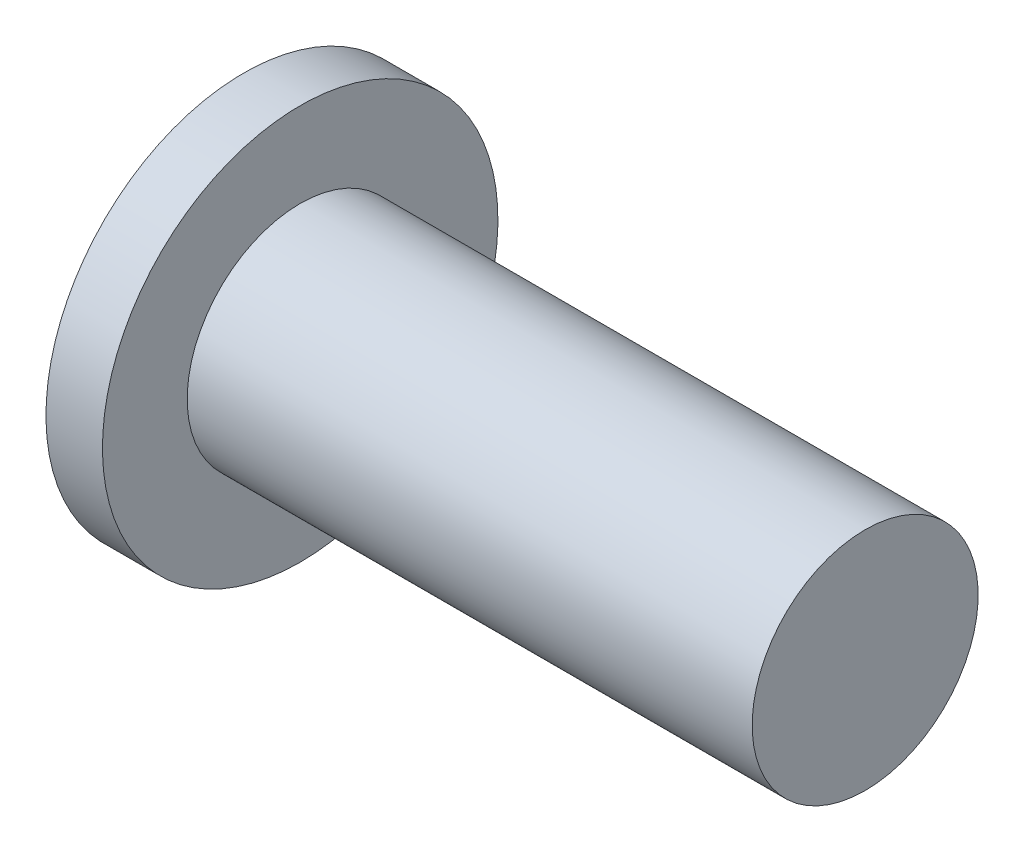
ISO-10303-21;
HEADER;
FILE_DESCRIPTION(('STEP AP214'),'2;1');
FILE_NAME('part.step','',(''),(''),'','','');
FILE_SCHEMA(('AUTOMOTIVE_DESIGN { 1 0 10303 214 1 1 1 1 }'));
ENDSEC;
DATA;
#1=APPLICATION_CONTEXT('core data for automotive mechanical design processes');
#2=APPLICATION_PROTOCOL_DEFINITION('international standard','automotive_design',2000,#1);
#3=PRODUCT_CONTEXT('',#1,'mechanical');
#4=PRODUCT('Part','Part','',(#3));
#5=PRODUCT_RELATED_PRODUCT_CATEGORY('part','',(#4));
#6=PRODUCT_DEFINITION_FORMATION('','',#4);
#7=PRODUCT_DEFINITION_CONTEXT('part definition',#1,'design');
#8=PRODUCT_DEFINITION('design','',#6,#7);
#9=PRODUCT_DEFINITION_SHAPE('','',#8);
#10=(LENGTH_UNIT() NAMED_UNIT(*) SI_UNIT(.MILLI.,.METRE.));
#11=(NAMED_UNIT(*) PLANE_ANGLE_UNIT() SI_UNIT($,.RADIAN.));
#12=(NAMED_UNIT(*) SI_UNIT($,.STERADIAN.) SOLID_ANGLE_UNIT());
#13=UNCERTAINTY_MEASURE_WITH_UNIT(LENGTH_MEASURE(1.E-05),#10,'distance_accuracy_value','');
#14=(GEOMETRIC_REPRESENTATION_CONTEXT(3) GLOBAL_UNCERTAINTY_ASSIGNED_CONTEXT((#13)) GLOBAL_UNIT_ASSIGNED_CONTEXT((#10,
#11,#12)) REPRESENTATION_CONTEXT('',''));
#15=CARTESIAN_POINT('',(0.,0.,0.));
#16=DIRECTION('',(0.,0.,1.));
#17=DIRECTION('',(1.,0.,0.));
#18=AXIS2_PLACEMENT_3D('',#15,#16,#17);
#19=CARTESIAN_POINT('',(0.,0.,0.));
#20=DIRECTION('',(-1.,0.,0.));
#21=DIRECTION('',(0.,-1.,0.));
#22=AXIS2_PLACEMENT_3D('',#19,#20,#21);
#23=PLANE('',#22);
#24=CARTESIAN_POINT('',(0.,-2.,0.));
#25=DIRECTION('',(-1.,0.,0.));
#26=DIRECTION('',(0.,-1.,0.));
#27=AXIS2_PLACEMENT_3D('',#24,#25,#26);
#28=CIRCLE('',#27,3.5);
#29=CARTESIAN_POINT('',(0.,-5.5,0.));
#30=VERTEX_POINT('',#29);
#31=EDGE_CURVE('E10',#30,#30,#28,.T.);
#32=ORIENTED_EDGE('',*,*,#31,.F.);
#33=EDGE_LOOP('',(#32));
#34=FACE_BOUND('',#33,.T.);
#35=CARTESIAN_POINT('',(0.,-2.,0.));
#36=DIRECTION('',(-1.,0.,0.));
#37=DIRECTION('',(0.,-1.,0.));
#38=AXIS2_PLACEMENT_3D('',#35,#36,#37);
#39=CIRCLE('',#38,2.);
#40=CARTESIAN_POINT('',(0.,-4.,0.));
#41=VERTEX_POINT('',#40);
#42=EDGE_CURVE('E47',#41,#41,#39,.T.);
#43=ORIENTED_EDGE('',*,*,#42,.T.);
#44=EDGE_LOOP('',(#43));
#45=FACE_BOUND('',#44,.T.);
#46=ADVANCED_FACE('F33',(#34,#45),#23,.F.);
#47=CARTESIAN_POINT('',(-1.,-2.,0.));
#48=DIRECTION('',(-1.,0.,0.));
#49=DIRECTION('',(0.,-1.,0.));
#50=AXIS2_PLACEMENT_3D('',#47,#48,#49);
#51=CYLINDRICAL_SURFACE('',#50,3.5);
#52=CARTESIAN_POINT('',(-1.,-2.,0.));
#53=DIRECTION('',(-1.,0.,0.));
#54=DIRECTION('',(0.,-1.,0.));
#55=AXIS2_PLACEMENT_3D('',#52,#53,#54);
#56=CIRCLE('',#55,3.5);
#57=CARTESIAN_POINT('',(-1.,-5.5,0.));
#58=VERTEX_POINT('',#57);
#59=EDGE_CURVE('E39',#58,#58,#56,.T.);
#60=ORIENTED_EDGE('',*,*,#59,.F.);
#61=EDGE_LOOP('',(#60));
#62=FACE_BOUND('',#61,.T.);
#63=ORIENTED_EDGE('',*,*,#31,.T.);
#64=EDGE_LOOP('',(#63));
#65=FACE_BOUND('',#64,.T.);
#66=ADVANCED_FACE('F67',(#62,#65),#51,.T.);
#67=CARTESIAN_POINT('',(-1.,1.5,0.));
#68=DIRECTION('',(1.,0.,0.));
#69=DIRECTION('',(0.,1.,0.));
#70=AXIS2_PLACEMENT_3D('',#67,#68,#69);
#71=PLANE('',#70);
#72=ORIENTED_EDGE('',*,*,#59,.T.);
#73=EDGE_LOOP('',(#72));
#74=FACE_BOUND('',#73,.T.);
#75=ADVANCED_FACE('F62',(#74),#71,.F.);
#76=CARTESIAN_POINT('',(10.,0.,0.));
#77=DIRECTION('',(-1.,0.,0.));
#78=DIRECTION('',(0.,-1.,0.));
#79=AXIS2_PLACEMENT_3D('',#76,#77,#78);
#80=PLANE('',#79);
#81=CARTESIAN_POINT('',(10.,-2.,0.));
#82=DIRECTION('',(-1.,0.,0.));
#83=DIRECTION('',(0.,-1.,0.));
#84=AXIS2_PLACEMENT_3D('',#81,#82,#83);
#85=CIRCLE('',#84,2.);
#86=CARTESIAN_POINT('',(10.,-4.,0.));
#87=VERTEX_POINT('',#86);
#88=EDGE_CURVE('E43',#87,#87,#85,.T.);
#89=ORIENTED_EDGE('',*,*,#88,.F.);
#90=EDGE_LOOP('',(#89));
#91=FACE_BOUND('',#90,.T.);
#92=ADVANCED_FACE('F57',(#91),#80,.F.);
#93=CARTESIAN_POINT('',(-1.,-2.,0.));
#94=DIRECTION('',(-1.,0.,0.));
#95=DIRECTION('',(0.,-1.,0.));
#96=AXIS2_PLACEMENT_3D('',#93,#94,#95);
#97=CYLINDRICAL_SURFACE('',#96,2.);
#98=ORIENTED_EDGE('',*,*,#42,.F.);
#99=EDGE_LOOP('',(#98));
#100=FACE_BOUND('',#99,.T.);
#101=ORIENTED_EDGE('',*,*,#88,.T.);
#102=EDGE_LOOP('',(#101));
#103=FACE_BOUND('',#102,.T.);
#104=ADVANCED_FACE('F54',(#100,#103),#97,.T.);
#105=CLOSED_SHELL('',(#46,#66,#75,#92,#104));
#106=MANIFOLD_SOLID_BREP('B2',#105);
#107=ADVANCED_BREP_SHAPE_REPRESENTATION('',(#18,#106),#14);
#108=SHAPE_DEFINITION_REPRESENTATION(#9,#107);
ENDSEC;
END-ISO-10303-21;
